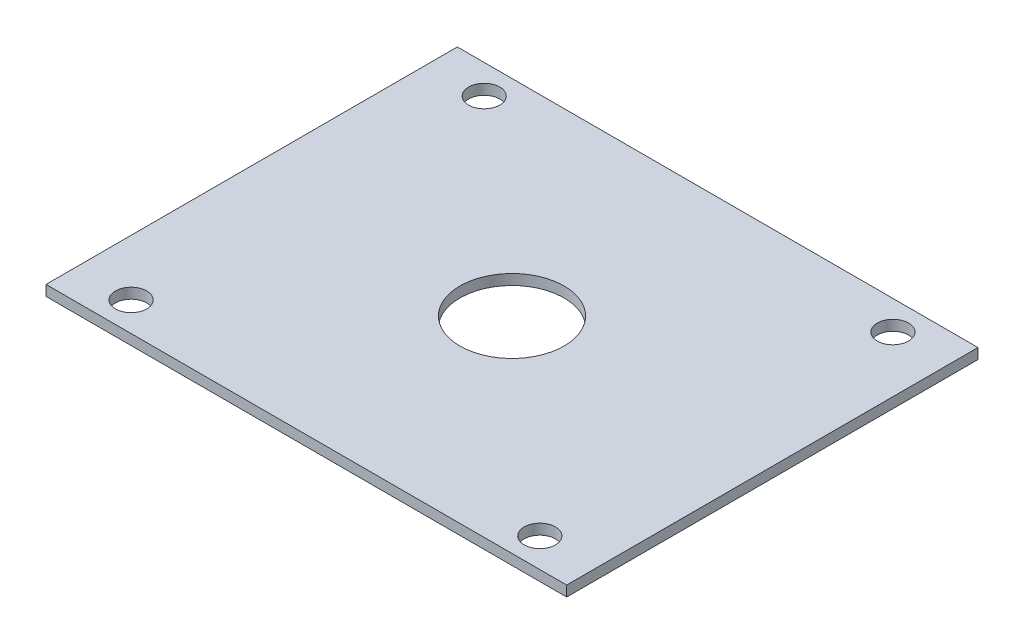
ISO-10303-21;
HEADER;
FILE_DESCRIPTION(('STEP AP214'),'2;1');
FILE_NAME('part.step','',(''),(''),'','','');
FILE_SCHEMA(('AUTOMOTIVE_DESIGN { 1 0 10303 214 1 1 1 1 }'));
ENDSEC;
DATA;
#1=APPLICATION_CONTEXT('core data for automotive mechanical design processes');
#2=APPLICATION_PROTOCOL_DEFINITION('international standard','automotive_design',2000,#1);
#3=PRODUCT_CONTEXT('',#1,'mechanical');
#4=PRODUCT('Part','Part','',(#3));
#5=PRODUCT_RELATED_PRODUCT_CATEGORY('part','',(#4));
#6=PRODUCT_DEFINITION_FORMATION('','',#4);
#7=PRODUCT_DEFINITION_CONTEXT('part definition',#1,'design');
#8=PRODUCT_DEFINITION('design','',#6,#7);
#9=PRODUCT_DEFINITION_SHAPE('','',#8);
#10=(LENGTH_UNIT() NAMED_UNIT(*) SI_UNIT(.MILLI.,.METRE.));
#11=(NAMED_UNIT(*) PLANE_ANGLE_UNIT() SI_UNIT($,.RADIAN.));
#12=(NAMED_UNIT(*) SI_UNIT($,.STERADIAN.) SOLID_ANGLE_UNIT());
#13=UNCERTAINTY_MEASURE_WITH_UNIT(LENGTH_MEASURE(1.E-05),#10,'distance_accuracy_value','');
#14=(GEOMETRIC_REPRESENTATION_CONTEXT(3) GLOBAL_UNCERTAINTY_ASSIGNED_CONTEXT((#13)) GLOBAL_UNIT_ASSIGNED_CONTEXT((#10,
#11,#12)) REPRESENTATION_CONTEXT('',''));
#15=CARTESIAN_POINT('',(0.,0.,0.));
#16=DIRECTION('',(0.,0.,1.));
#17=DIRECTION('',(1.,0.,0.));
#18=AXIS2_PLACEMENT_3D('',#15,#16,#17);
#19=CARTESIAN_POINT('',(0.,1.,0.));
#20=DIRECTION('',(0.,-1.,0.));
#21=DIRECTION('',(0.,0.,-1.));
#22=AXIS2_PLACEMENT_3D('',#19,#20,#21);
#23=PLANE('',#22);
#24=CARTESIAN_POINT('',(0.,1.,0.));
#25=DIRECTION('',(0.,1.,0.));
#26=DIRECTION('',(0.,0.,1.));
#27=AXIS2_PLACEMENT_3D('',#24,#25,#26);
#28=CIRCLE('',#27,5.);
#29=CARTESIAN_POINT('',(0.,1.,5.));
#30=VERTEX_POINT('',#29);
#31=EDGE_CURVE('E138',#30,#30,#28,.T.);
#32=ORIENTED_EDGE('',*,*,#31,.F.);
#33=EDGE_LOOP('',(#32));
#34=FACE_BOUND('',#33,.T.);
#35=DIRECTION('',(0.,0.,-1.));
#36=VECTOR('',#35,1.);
#37=CARTESIAN_POINT('',(25.,1.,19.75));
#38=LINE('',#37,#36);
#39=CARTESIAN_POINT('',(25.,1.,19.75));
#40=VERTEX_POINT('',#39);
#41=CARTESIAN_POINT('',(25.,1.,-19.75));
#42=VERTEX_POINT('',#41);
#43=EDGE_CURVE('E87',#40,#42,#38,.T.);
#44=ORIENTED_EDGE('',*,*,#43,.T.);
#45=DIRECTION('',(-1.,0.,0.));
#46=VECTOR('',#45,1.);
#47=CARTESIAN_POINT('',(-25.,1.,-19.75));
#48=LINE('',#47,#46);
#49=CARTESIAN_POINT('',(-25.,1.,-19.75));
#50=VERTEX_POINT('',#49);
#51=EDGE_CURVE('E82',#42,#50,#48,.T.);
#52=ORIENTED_EDGE('',*,*,#51,.T.);
#53=DIRECTION('',(0.,0.,1.));
#54=VECTOR('',#53,1.);
#55=CARTESIAN_POINT('',(-25.,1.,19.75));
#56=LINE('',#55,#54);
#57=CARTESIAN_POINT('',(-25.,1.,19.75));
#58=VERTEX_POINT('',#57);
#59=EDGE_CURVE('E85',#50,#58,#56,.T.);
#60=ORIENTED_EDGE('',*,*,#59,.T.);
#61=DIRECTION('',(1.,0.,0.));
#62=VECTOR('',#61,1.);
#63=CARTESIAN_POINT('',(-25.,1.,19.75));
#64=LINE('',#63,#62);
#65=EDGE_CURVE('E52',#58,#40,#64,.T.);
#66=ORIENTED_EDGE('',*,*,#65,.T.);
#67=EDGE_LOOP('',(#44,#52,#60,#66));
#68=FACE_BOUND('',#67,.T.);
#69=CARTESIAN_POINT('',(-19.625,1.,-16.955));
#70=DIRECTION('',(0.,1.,0.));
#71=DIRECTION('',(0.,0.,1.));
#72=AXIS2_PLACEMENT_3D('',#69,#70,#71);
#73=CIRCLE('',#72,1.5);
#74=CARTESIAN_POINT('',(-19.625,1.,-15.455));
#75=VERTEX_POINT('',#74);
#76=EDGE_CURVE('E102',#75,#75,#73,.T.);
#77=ORIENTED_EDGE('',*,*,#76,.F.);
#78=EDGE_LOOP('',(#77));
#79=FACE_BOUND('',#78,.T.);
#80=CARTESIAN_POINT('',(-19.625,1.,16.955));
#81=DIRECTION('',(0.,1.,0.));
#82=DIRECTION('',(0.,0.,1.));
#83=AXIS2_PLACEMENT_3D('',#80,#81,#82);
#84=CIRCLE('',#83,1.5);
#85=CARTESIAN_POINT('',(-19.625,1.,18.455));
#86=VERTEX_POINT('',#85);
#87=EDGE_CURVE('E117',#86,#86,#84,.T.);
#88=ORIENTED_EDGE('',*,*,#87,.F.);
#89=EDGE_LOOP('',(#88));
#90=FACE_BOUND('',#89,.T.);
#91=CARTESIAN_POINT('',(19.625,1.,-16.955));
#92=DIRECTION('',(0.,1.,0.));
#93=DIRECTION('',(0.,0.,1.));
#94=AXIS2_PLACEMENT_3D('',#91,#92,#93);
#95=CIRCLE('',#94,1.5);
#96=CARTESIAN_POINT('',(19.625,1.,-15.455));
#97=VERTEX_POINT('',#96);
#98=EDGE_CURVE('E123',#97,#97,#95,.T.);
#99=ORIENTED_EDGE('',*,*,#98,.F.);
#100=EDGE_LOOP('',(#99));
#101=FACE_BOUND('',#100,.T.);
#102=CARTESIAN_POINT('',(19.625,1.,16.955));
#103=DIRECTION('',(0.,1.,0.));
#104=DIRECTION('',(0.,0.,1.));
#105=AXIS2_PLACEMENT_3D('',#102,#103,#104);
#106=CIRCLE('',#105,1.5);
#107=CARTESIAN_POINT('',(19.625,1.,18.455));
#108=VERTEX_POINT('',#107);
#109=EDGE_CURVE('E129',#108,#108,#106,.T.);
#110=ORIENTED_EDGE('',*,*,#109,.F.);
#111=EDGE_LOOP('',(#110));
#112=FACE_BOUND('',#111,.T.);
#113=ADVANCED_FACE('F35',(#34,#68,#79,#90,#101,#112),#23,.F.);
#114=CARTESIAN_POINT('',(0.,0.,0.));
#115=DIRECTION('',(0.,-1.,0.));
#116=DIRECTION('',(0.,0.,-1.));
#117=AXIS2_PLACEMENT_3D('',#114,#115,#116);
#118=PLANE('',#117);
#119=CARTESIAN_POINT('',(0.,0.,0.));
#120=DIRECTION('',(0.,1.,0.));
#121=DIRECTION('',(0.,0.,1.));
#122=AXIS2_PLACEMENT_3D('',#119,#120,#121);
#123=CIRCLE('',#122,5.);
#124=CARTESIAN_POINT('',(0.,0.,5.));
#125=VERTEX_POINT('',#124);
#126=EDGE_CURVE('E135',#125,#125,#123,.T.);
#127=ORIENTED_EDGE('',*,*,#126,.T.);
#128=EDGE_LOOP('',(#127));
#129=FACE_BOUND('',#128,.T.);
#130=CARTESIAN_POINT('',(19.625,0.,-16.955));
#131=DIRECTION('',(0.,1.,0.));
#132=DIRECTION('',(0.,0.,1.));
#133=AXIS2_PLACEMENT_3D('',#130,#131,#132);
#134=CIRCLE('',#133,1.5);
#135=CARTESIAN_POINT('',(19.625,0.,-15.455));
#136=VERTEX_POINT('',#135);
#137=EDGE_CURVE('E126',#136,#136,#134,.T.);
#138=ORIENTED_EDGE('',*,*,#137,.T.);
#139=EDGE_LOOP('',(#138));
#140=FACE_BOUND('',#139,.T.);
#141=CARTESIAN_POINT('',(-19.625,0.,-16.955));
#142=DIRECTION('',(0.,1.,0.));
#143=DIRECTION('',(0.,0.,1.));
#144=AXIS2_PLACEMENT_3D('',#141,#142,#143);
#145=CIRCLE('',#144,1.5);
#146=CARTESIAN_POINT('',(-19.625,0.,-15.455));
#147=VERTEX_POINT('',#146);
#148=EDGE_CURVE('E114',#147,#147,#145,.T.);
#149=ORIENTED_EDGE('',*,*,#148,.T.);
#150=EDGE_LOOP('',(#149));
#151=FACE_BOUND('',#150,.T.);
#152=DIRECTION('',(0.,0.,-1.));
#153=VECTOR('',#152,1.);
#154=CARTESIAN_POINT('',(25.,0.,19.75));
#155=LINE('',#154,#153);
#156=CARTESIAN_POINT('',(25.,0.,19.75));
#157=VERTEX_POINT('',#156);
#158=CARTESIAN_POINT('',(25.,0.,-19.75));
#159=VERTEX_POINT('',#158);
#160=EDGE_CURVE('E99',#157,#159,#155,.T.);
#161=ORIENTED_EDGE('',*,*,#160,.F.);
#162=DIRECTION('',(1.,0.,0.));
#163=VECTOR('',#162,1.);
#164=CARTESIAN_POINT('',(-25.,0.,19.75));
#165=LINE('',#164,#163);
#166=CARTESIAN_POINT('',(-25.,0.,19.75));
#167=VERTEX_POINT('',#166);
#168=EDGE_CURVE('E75',#167,#157,#165,.T.);
#169=ORIENTED_EDGE('',*,*,#168,.F.);
#170=DIRECTION('',(0.,0.,1.));
#171=VECTOR('',#170,1.);
#172=CARTESIAN_POINT('',(-25.,0.,19.75));
#173=LINE('',#172,#171);
#174=CARTESIAN_POINT('',(-25.,0.,-19.75));
#175=VERTEX_POINT('',#174);
#176=EDGE_CURVE('E69',#175,#167,#173,.T.);
#177=ORIENTED_EDGE('',*,*,#176,.F.);
#178=DIRECTION('',(-1.,0.,0.));
#179=VECTOR('',#178,1.);
#180=CARTESIAN_POINT('',(-25.,0.,-19.75));
#181=LINE('',#180,#179);
#182=EDGE_CURVE('E91',#159,#175,#181,.T.);
#183=ORIENTED_EDGE('',*,*,#182,.F.);
#184=EDGE_LOOP('',(#161,#169,#177,#183));
#185=FACE_BOUND('',#184,.T.);
#186=CARTESIAN_POINT('',(-19.625,0.,16.955));
#187=DIRECTION('',(0.,1.,0.));
#188=DIRECTION('',(0.,0.,1.));
#189=AXIS2_PLACEMENT_3D('',#186,#187,#188);
#190=CIRCLE('',#189,1.5);
#191=CARTESIAN_POINT('',(-19.625,0.,18.455));
#192=VERTEX_POINT('',#191);
#193=EDGE_CURVE('E120',#192,#192,#190,.T.);
#194=ORIENTED_EDGE('',*,*,#193,.T.);
#195=EDGE_LOOP('',(#194));
#196=FACE_BOUND('',#195,.T.);
#197=CARTESIAN_POINT('',(19.625,0.,16.955));
#198=DIRECTION('',(0.,1.,0.));
#199=DIRECTION('',(0.,0.,1.));
#200=AXIS2_PLACEMENT_3D('',#197,#198,#199);
#201=CIRCLE('',#200,1.5);
#202=CARTESIAN_POINT('',(19.625,0.,18.455));
#203=VERTEX_POINT('',#202);
#204=EDGE_CURVE('E132',#203,#203,#201,.T.);
#205=ORIENTED_EDGE('',*,*,#204,.T.);
#206=EDGE_LOOP('',(#205));
#207=FACE_BOUND('',#206,.T.);
#208=ADVANCED_FACE('F110',(#129,#140,#151,#185,#196,#207),#118,.T.);
#209=CARTESIAN_POINT('',(25.,1.,19.75));
#210=DIRECTION('',(-1.,0.,0.));
#211=DIRECTION('',(0.,0.,1.));
#212=AXIS2_PLACEMENT_3D('',#209,#210,#211);
#213=PLANE('',#212);
#214=ORIENTED_EDGE('',*,*,#160,.T.);
#215=DIRECTION('',(0.,-1.,0.));
#216=VECTOR('',#215,1.);
#217=CARTESIAN_POINT('',(25.,1.,-19.75));
#218=LINE('',#217,#216);
#219=EDGE_CURVE('E11',#42,#159,#218,.T.);
#220=ORIENTED_EDGE('',*,*,#219,.F.);
#221=ORIENTED_EDGE('',*,*,#43,.F.);
#222=DIRECTION('',(0.,-1.,0.));
#223=VECTOR('',#222,1.);
#224=CARTESIAN_POINT('',(25.,1.,19.75));
#225=LINE('',#224,#223);
#226=EDGE_CURVE('E95',#40,#157,#225,.T.);
#227=ORIENTED_EDGE('',*,*,#226,.T.);
#228=EDGE_LOOP('',(#214,#220,#221,#227));
#229=FACE_BOUND('',#228,.T.);
#230=ADVANCED_FACE('F37',(#229),#213,.F.);
#231=CARTESIAN_POINT('',(-25.,1.,-19.75));
#232=DIRECTION('',(0.,0.,1.));
#233=DIRECTION('',(1.,0.,0.));
#234=AXIS2_PLACEMENT_3D('',#231,#232,#233);
#235=PLANE('',#234);
#236=ORIENTED_EDGE('',*,*,#182,.T.);
#237=DIRECTION('',(0.,-1.,0.));
#238=VECTOR('',#237,1.);
#239=CARTESIAN_POINT('',(-25.,1.,-19.75));
#240=LINE('',#239,#238);
#241=EDGE_CURVE('E44',#50,#175,#240,.T.);
#242=ORIENTED_EDGE('',*,*,#241,.F.);
#243=ORIENTED_EDGE('',*,*,#51,.F.);
#244=ORIENTED_EDGE('',*,*,#219,.T.);
#245=EDGE_LOOP('',(#236,#242,#243,#244));
#246=FACE_BOUND('',#245,.T.);
#247=ADVANCED_FACE('F90',(#246),#235,.F.);
#248=CARTESIAN_POINT('',(-25.,1.,19.75));
#249=DIRECTION('',(1.,0.,0.));
#250=DIRECTION('',(0.,0.,-1.));
#251=AXIS2_PLACEMENT_3D('',#248,#249,#250);
#252=PLANE('',#251);
#253=ORIENTED_EDGE('',*,*,#176,.T.);
#254=DIRECTION('',(0.,-1.,0.));
#255=VECTOR('',#254,1.);
#256=CARTESIAN_POINT('',(-25.,1.,19.75));
#257=LINE('',#256,#255);
#258=EDGE_CURVE('E92',#58,#167,#257,.T.);
#259=ORIENTED_EDGE('',*,*,#258,.F.);
#260=ORIENTED_EDGE('',*,*,#59,.F.);
#261=ORIENTED_EDGE('',*,*,#241,.T.);
#262=EDGE_LOOP('',(#253,#259,#260,#261));
#263=FACE_BOUND('',#262,.T.);
#264=ADVANCED_FACE('F93',(#263),#252,.F.);
#265=CARTESIAN_POINT('',(-25.,1.,19.75));
#266=DIRECTION('',(0.,0.,-1.));
#267=DIRECTION('',(-1.,0.,0.));
#268=AXIS2_PLACEMENT_3D('',#265,#266,#267);
#269=PLANE('',#268);
#270=ORIENTED_EDGE('',*,*,#168,.T.);
#271=ORIENTED_EDGE('',*,*,#226,.F.);
#272=ORIENTED_EDGE('',*,*,#65,.F.);
#273=ORIENTED_EDGE('',*,*,#258,.T.);
#274=EDGE_LOOP('',(#270,#271,#272,#273));
#275=FACE_BOUND('',#274,.T.);
#276=ADVANCED_FACE('F107',(#275),#269,.F.);
#277=CARTESIAN_POINT('',(-19.625,1.,-16.955));
#278=DIRECTION('',(0.,-1.,0.));
#279=DIRECTION('',(0.,0.,-1.));
#280=AXIS2_PLACEMENT_3D('',#277,#278,#279);
#281=CYLINDRICAL_SURFACE('',#280,1.5);
#282=ORIENTED_EDGE('',*,*,#76,.T.);
#283=EDGE_LOOP('',(#282));
#284=FACE_BOUND('',#283,.T.);
#285=ORIENTED_EDGE('',*,*,#148,.F.);
#286=EDGE_LOOP('',(#285));
#287=FACE_BOUND('',#286,.T.);
#288=ADVANCED_FACE('F160',(#284,#287),#281,.F.);
#289=CARTESIAN_POINT('',(-19.625,1.,16.955));
#290=DIRECTION('',(0.,-1.,0.));
#291=DIRECTION('',(0.,0.,-1.));
#292=AXIS2_PLACEMENT_3D('',#289,#290,#291);
#293=CYLINDRICAL_SURFACE('',#292,1.5);
#294=ORIENTED_EDGE('',*,*,#87,.T.);
#295=EDGE_LOOP('',(#294));
#296=FACE_BOUND('',#295,.T.);
#297=ORIENTED_EDGE('',*,*,#193,.F.);
#298=EDGE_LOOP('',(#297));
#299=FACE_BOUND('',#298,.T.);
#300=ADVANCED_FACE('F200',(#296,#299),#293,.F.);
#301=CARTESIAN_POINT('',(19.625,1.,-16.955));
#302=DIRECTION('',(0.,-1.,0.));
#303=DIRECTION('',(0.,0.,-1.));
#304=AXIS2_PLACEMENT_3D('',#301,#302,#303);
#305=CYLINDRICAL_SURFACE('',#304,1.5);
#306=ORIENTED_EDGE('',*,*,#98,.T.);
#307=EDGE_LOOP('',(#306));
#308=FACE_BOUND('',#307,.T.);
#309=ORIENTED_EDGE('',*,*,#137,.F.);
#310=EDGE_LOOP('',(#309));
#311=FACE_BOUND('',#310,.T.);
#312=ADVANCED_FACE('F193',(#308,#311),#305,.F.);
#313=CARTESIAN_POINT('',(19.625,1.,16.955));
#314=DIRECTION('',(0.,-1.,0.));
#315=DIRECTION('',(0.,0.,-1.));
#316=AXIS2_PLACEMENT_3D('',#313,#314,#315);
#317=CYLINDRICAL_SURFACE('',#316,1.5);
#318=ORIENTED_EDGE('',*,*,#109,.T.);
#319=EDGE_LOOP('',(#318));
#320=FACE_BOUND('',#319,.T.);
#321=ORIENTED_EDGE('',*,*,#204,.F.);
#322=EDGE_LOOP('',(#321));
#323=FACE_BOUND('',#322,.T.);
#324=ADVANCED_FACE('F149',(#320,#323),#317,.F.);
#325=CARTESIAN_POINT('',(0.,0.,0.));
#326=DIRECTION('',(0.,1.,0.));
#327=DIRECTION('',(0.,0.,1.));
#328=AXIS2_PLACEMENT_3D('',#325,#326,#327);
#329=CYLINDRICAL_SURFACE('',#328,5.);
#330=ORIENTED_EDGE('',*,*,#126,.F.);
#331=EDGE_LOOP('',(#330));
#332=FACE_BOUND('',#331,.T.);
#333=ORIENTED_EDGE('',*,*,#31,.T.);
#334=EDGE_LOOP('',(#333));
#335=FACE_BOUND('',#334,.T.);
#336=ADVANCED_FACE('F146',(#332,#335),#329,.F.);
#337=CLOSED_SHELL('',(#113,#208,#230,#247,#264,#276,#288,#300,#312,#324,#336));
#338=MANIFOLD_SOLID_BREP('B2',#337);
#339=ADVANCED_BREP_SHAPE_REPRESENTATION('',(#18,#338),#14);
#340=SHAPE_DEFINITION_REPRESENTATION(#9,#339);
ENDSEC;
END-ISO-10303-21;
